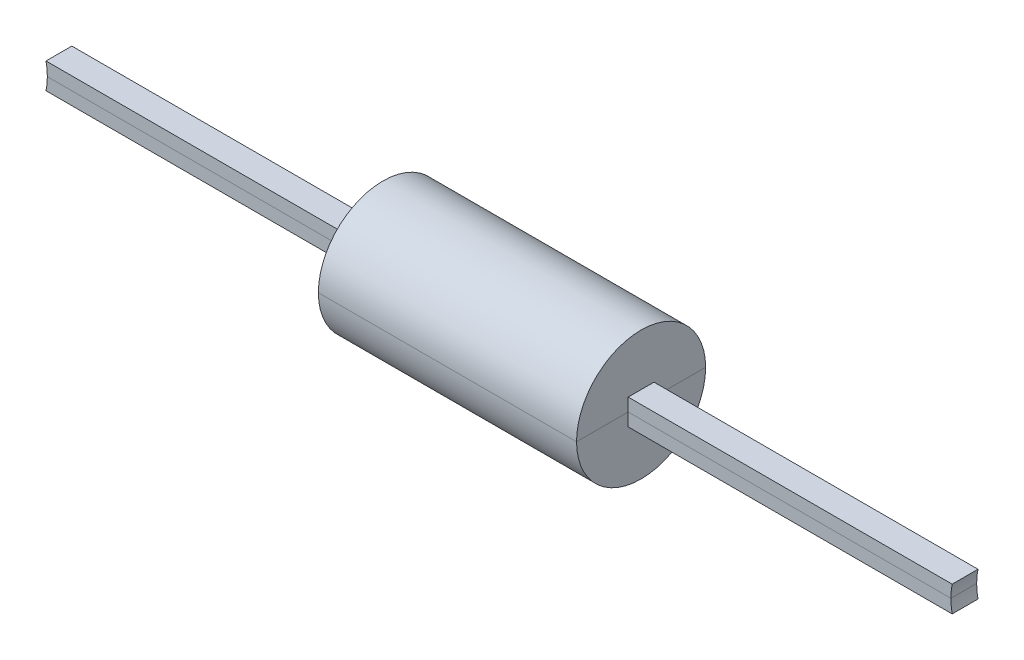
ISO-10303-21;
HEADER;
FILE_DESCRIPTION(('STEP AP214'),'2;1');
FILE_NAME('part.step','',(''),(''),'','','');
FILE_SCHEMA(('AUTOMOTIVE_DESIGN { 1 0 10303 214 1 1 1 1 }'));
ENDSEC;
DATA;
#1=APPLICATION_CONTEXT('core data for automotive mechanical design processes');
#2=APPLICATION_PROTOCOL_DEFINITION('international standard','automotive_design',2000,#1);
#3=PRODUCT_CONTEXT('',#1,'mechanical');
#4=PRODUCT('Part','Part','',(#3));
#5=PRODUCT_RELATED_PRODUCT_CATEGORY('part','',(#4));
#6=PRODUCT_DEFINITION_FORMATION('','',#4);
#7=PRODUCT_DEFINITION_CONTEXT('part definition',#1,'design');
#8=PRODUCT_DEFINITION('design','',#6,#7);
#9=PRODUCT_DEFINITION_SHAPE('','',#8);
#10=(LENGTH_UNIT() NAMED_UNIT(*) SI_UNIT(.MILLI.,.METRE.));
#11=(NAMED_UNIT(*) PLANE_ANGLE_UNIT() SI_UNIT($,.RADIAN.));
#12=(NAMED_UNIT(*) SI_UNIT($,.STERADIAN.) SOLID_ANGLE_UNIT());
#13=UNCERTAINTY_MEASURE_WITH_UNIT(LENGTH_MEASURE(1.E-05),#10,'distance_accuracy_value','');
#14=(GEOMETRIC_REPRESENTATION_CONTEXT(3) GLOBAL_UNCERTAINTY_ASSIGNED_CONTEXT((#13)) GLOBAL_UNIT_ASSIGNED_CONTEXT((#10,
#11,#12)) REPRESENTATION_CONTEXT('',''));
#15=CARTESIAN_POINT('',(0.,0.,0.));
#16=DIRECTION('',(0.,0.,1.));
#17=DIRECTION('',(1.,0.,0.));
#18=AXIS2_PLACEMENT_3D('',#15,#16,#17);
#19=CARTESIAN_POINT('',(0.,0.,0.));
#20=DIRECTION('',(0.,1.,0.));
#21=DIRECTION('',(0.,0.,1.));
#22=AXIS2_PLACEMENT_3D('',#19,#20,#21);
#23=PLANE('',#22);
#24=DIRECTION('',(-1.,0.,0.));
#25=VECTOR('',#24,1.);
#26=CARTESIAN_POINT('',(0.,0.,1.));
#27=LINE('',#26,#25);
#28=CARTESIAN_POINT('',(-10.,0.,1.));
#29=VERTEX_POINT('',#28);
#30=CARTESIAN_POINT('',(-35.,0.,1.));
#31=VERTEX_POINT('',#30);
#32=EDGE_CURVE('E192',#29,#31,#27,.T.);
#33=ORIENTED_EDGE('',*,*,#32,.F.);
#34=DIRECTION('',(0.,0.,1.));
#35=VECTOR('',#34,1.);
#36=CARTESIAN_POINT('',(-10.,0.,0.));
#37=LINE('',#36,#35);
#38=CARTESIAN_POINT('',(-10.,0.,5.));
#39=VERTEX_POINT('',#38);
#40=EDGE_CURVE('E159',#29,#39,#37,.T.);
#41=ORIENTED_EDGE('',*,*,#40,.T.);
#42=DIRECTION('',(-1.,0.,0.));
#43=VECTOR('',#42,1.);
#44=CARTESIAN_POINT('',(10.,0.,5.));
#45=LINE('',#44,#43);
#46=CARTESIAN_POINT('',(10.,0.,5.));
#47=VERTEX_POINT('',#46);
#48=EDGE_CURVE('E197',#39,#47,#45,.F.);
#49=ORIENTED_EDGE('',*,*,#48,.T.);
#50=DIRECTION('',(0.,0.,1.));
#51=VECTOR('',#50,1.);
#52=CARTESIAN_POINT('',(10.,0.,0.));
#53=LINE('',#52,#51);
#54=CARTESIAN_POINT('',(10.,0.,1.));
#55=VERTEX_POINT('',#54);
#56=EDGE_CURVE('E151',#55,#47,#53,.T.);
#57=ORIENTED_EDGE('',*,*,#56,.F.);
#58=DIRECTION('',(-1.,0.,0.));
#59=VECTOR('',#58,1.);
#60=CARTESIAN_POINT('',(0.,0.,1.));
#61=LINE('',#60,#59);
#62=CARTESIAN_POINT('',(35.,0.,1.));
#63=VERTEX_POINT('',#62);
#64=EDGE_CURVE('E166',#63,#55,#61,.T.);
#65=ORIENTED_EDGE('',*,*,#64,.F.);
#66=DIRECTION('',(0.,0.,-1.));
#67=VECTOR('',#66,1.);
#68=CARTESIAN_POINT('',(35.,0.,1.));
#69=LINE('',#68,#67);
#70=CARTESIAN_POINT('',(35.,0.,-1.));
#71=VERTEX_POINT('',#70);
#72=EDGE_CURVE('E155',#71,#63,#69,.F.);
#73=ORIENTED_EDGE('',*,*,#72,.F.);
#74=DIRECTION('',(-1.,0.,0.));
#75=VECTOR('',#74,1.);
#76=CARTESIAN_POINT('',(0.,0.,-1.));
#77=LINE('',#76,#75);
#78=CARTESIAN_POINT('',(10.,0.,-1.));
#79=VERTEX_POINT('',#78);
#80=EDGE_CURVE('E135',#71,#79,#77,.T.);
#81=ORIENTED_EDGE('',*,*,#80,.T.);
#82=CARTESIAN_POINT('',(10.,0.,-5.));
#83=VERTEX_POINT('',#82);
#84=EDGE_CURVE('E144',#83,#79,#53,.T.);
#85=ORIENTED_EDGE('',*,*,#84,.F.);
#86=DIRECTION('',(-1.,0.,0.));
#87=VECTOR('',#86,1.);
#88=CARTESIAN_POINT('',(10.,0.,-5.));
#89=LINE('',#88,#87);
#90=CARTESIAN_POINT('',(-10.,0.,-5.));
#91=VERTEX_POINT('',#90);
#92=EDGE_CURVE('E152',#83,#91,#89,.T.);
#93=ORIENTED_EDGE('',*,*,#92,.T.);
#94=CARTESIAN_POINT('',(-10.,0.,-1.));
#95=VERTEX_POINT('',#94);
#96=EDGE_CURVE('E199',#91,#95,#37,.T.);
#97=ORIENTED_EDGE('',*,*,#96,.T.);
#98=DIRECTION('',(-1.,0.,0.));
#99=VECTOR('',#98,1.);
#100=CARTESIAN_POINT('',(0.,0.,-1.));
#101=LINE('',#100,#99);
#102=CARTESIAN_POINT('',(-35.,0.,-1.));
#103=VERTEX_POINT('',#102);
#104=EDGE_CURVE('E156',#95,#103,#101,.T.);
#105=ORIENTED_EDGE('',*,*,#104,.T.);
#106=DIRECTION('',(0.,0.,-1.));
#107=VECTOR('',#106,1.);
#108=CARTESIAN_POINT('',(-35.,0.,1.));
#109=LINE('',#108,#107);
#110=EDGE_CURVE('E194',#31,#103,#109,.T.);
#111=ORIENTED_EDGE('',*,*,#110,.F.);
#112=EDGE_LOOP('',(#33,#41,#49,#57,#65,#73,#81,#85,#93,#97,#105,#111));
#113=FACE_BOUND('',#112,.T.);
#114=ADVANCED_FACE('F48',(#113),#23,.T.);
#115=CARTESIAN_POINT('',(10.,0.,0.));
#116=DIRECTION('',(-1.,0.,0.));
#117=DIRECTION('',(0.,0.,1.));
#118=AXIS2_PLACEMENT_3D('',#115,#116,#117);
#119=CYLINDRICAL_SURFACE('',#118,5.);
#120=ORIENTED_EDGE('',*,*,#92,.F.);
#121=CARTESIAN_POINT('',(10.,0.,0.));
#122=DIRECTION('',(1.,0.,0.));
#123=DIRECTION('',(0.,0.,-1.));
#124=AXIS2_PLACEMENT_3D('',#121,#122,#123);
#125=CIRCLE('',#124,5.);
#126=EDGE_CURVE('E147',#47,#83,#125,.T.);
#127=ORIENTED_EDGE('',*,*,#126,.F.);
#128=ORIENTED_EDGE('',*,*,#48,.F.);
#129=CARTESIAN_POINT('',(-10.,0.,0.));
#130=DIRECTION('',(1.,0.,0.));
#131=DIRECTION('',(0.,0.,-1.));
#132=AXIS2_PLACEMENT_3D('',#129,#130,#131);
#133=CIRCLE('',#132,5.);
#134=EDGE_CURVE('E169',#39,#91,#133,.T.);
#135=ORIENTED_EDGE('',*,*,#134,.T.);
#136=EDGE_LOOP('',(#120,#127,#128,#135));
#137=FACE_BOUND('',#136,.T.);
#138=ADVANCED_FACE('F221',(#137),#119,.T.);
#139=CARTESIAN_POINT('',(10.,0.,0.));
#140=DIRECTION('',(1.,0.,0.));
#141=DIRECTION('',(0.,0.,-1.));
#142=AXIS2_PLACEMENT_3D('',#139,#140,#141);
#143=PLANE('',#142);
#144=ORIENTED_EDGE('',*,*,#126,.T.);
#145=ORIENTED_EDGE('',*,*,#84,.T.);
#146=DIRECTION('',(0.,-1.,0.));
#147=VECTOR('',#146,1.);
#148=CARTESIAN_POINT('',(10.,0.,-1.));
#149=LINE('',#148,#147);
#150=CARTESIAN_POINT('',(10.,-1.,-1.));
#151=VERTEX_POINT('',#150);
#152=EDGE_CURVE('E131',#79,#151,#149,.T.);
#153=ORIENTED_EDGE('',*,*,#152,.T.);
#154=DIRECTION('',(0.,0.,1.));
#155=VECTOR('',#154,1.);
#156=CARTESIAN_POINT('',(10.,-1.,0.));
#157=LINE('',#156,#155);
#158=CARTESIAN_POINT('',(10.,-1.,1.));
#159=VERTEX_POINT('',#158);
#160=EDGE_CURVE('E171',#151,#159,#157,.T.);
#161=ORIENTED_EDGE('',*,*,#160,.T.);
#162=DIRECTION('',(0.,-1.,0.));
#163=VECTOR('',#162,1.);
#164=CARTESIAN_POINT('',(10.,0.,1.));
#165=LINE('',#164,#163);
#166=EDGE_CURVE('E141',#55,#159,#165,.T.);
#167=ORIENTED_EDGE('',*,*,#166,.F.);
#168=ORIENTED_EDGE('',*,*,#56,.T.);
#169=EDGE_LOOP('',(#144,#145,#153,#161,#167,#168));
#170=FACE_BOUND('',#169,.T.);
#171=ADVANCED_FACE('F145',(#170),#143,.T.);
#172=CARTESIAN_POINT('',(-10.,0.,0.));
#173=DIRECTION('',(1.,0.,0.));
#174=DIRECTION('',(0.,0.,-1.));
#175=AXIS2_PLACEMENT_3D('',#172,#173,#174);
#176=PLANE('',#175);
#177=ORIENTED_EDGE('',*,*,#96,.F.);
#178=ORIENTED_EDGE('',*,*,#134,.F.);
#179=ORIENTED_EDGE('',*,*,#40,.F.);
#180=DIRECTION('',(0.,-1.,0.));
#181=VECTOR('',#180,1.);
#182=CARTESIAN_POINT('',(-10.,0.,1.));
#183=LINE('',#182,#181);
#184=CARTESIAN_POINT('',(-10.,-1.,1.));
#185=VERTEX_POINT('',#184);
#186=EDGE_CURVE('E163',#29,#185,#183,.T.);
#187=ORIENTED_EDGE('',*,*,#186,.T.);
#188=DIRECTION('',(0.,0.,1.));
#189=VECTOR('',#188,1.);
#190=CARTESIAN_POINT('',(-10.,-1.,0.));
#191=LINE('',#190,#189);
#192=CARTESIAN_POINT('',(-10.,-1.,-1.));
#193=VERTEX_POINT('',#192);
#194=EDGE_CURVE('E165',#193,#185,#191,.T.);
#195=ORIENTED_EDGE('',*,*,#194,.F.);
#196=DIRECTION('',(0.,-1.,0.));
#197=VECTOR('',#196,1.);
#198=CARTESIAN_POINT('',(-10.,0.,-1.));
#199=LINE('',#198,#197);
#200=EDGE_CURVE('E83',#95,#193,#199,.T.);
#201=ORIENTED_EDGE('',*,*,#200,.F.);
#202=EDGE_LOOP('',(#177,#178,#179,#187,#195,#201));
#203=FACE_BOUND('',#202,.T.);
#204=ADVANCED_FACE('F229',(#203),#176,.F.);
#205=CARTESIAN_POINT('',(-40.,0.,1.));
#206=DIRECTION('',(0.,0.,-1.));
#207=DIRECTION('',(-1.,0.,0.));
#208=AXIS2_PLACEMENT_3D('',#205,#206,#207);
#209=CYLINDRICAL_SURFACE('',#208,5.);
#210=CARTESIAN_POINT('',(-40.,0.,1.));
#211=DIRECTION('',(0.,0.,1.));
#212=DIRECTION('',(1.,0.,0.));
#213=AXIS2_PLACEMENT_3D('',#210,#211,#212);
#214=CIRCLE('',#213,5.);
#215=CARTESIAN_POINT('',(-35.1010205144336,-1.,1.));
#216=VERTEX_POINT('',#215);
#217=EDGE_CURVE('E173',#216,#31,#214,.T.);
#218=ORIENTED_EDGE('',*,*,#217,.T.);
#219=ORIENTED_EDGE('',*,*,#110,.T.);
#220=CARTESIAN_POINT('',(-40.,0.,-1.));
#221=DIRECTION('',(0.,0.,1.));
#222=DIRECTION('',(1.,0.,0.));
#223=AXIS2_PLACEMENT_3D('',#220,#221,#222);
#224=CIRCLE('',#223,5.);
#225=CARTESIAN_POINT('',(-35.1010205144336,-1.,-1.));
#226=VERTEX_POINT('',#225);
#227=EDGE_CURVE('E57',#226,#103,#224,.T.);
#228=ORIENTED_EDGE('',*,*,#227,.F.);
#229=DIRECTION('',(0.,0.,-1.));
#230=VECTOR('',#229,1.);
#231=CARTESIAN_POINT('',(-35.1010205144336,-1.,1.));
#232=LINE('',#231,#230);
#233=EDGE_CURVE('E65',#216,#226,#232,.T.);
#234=ORIENTED_EDGE('',*,*,#233,.F.);
#235=EDGE_LOOP('',(#218,#219,#228,#234));
#236=FACE_BOUND('',#235,.T.);
#237=ADVANCED_FACE('F215',(#236),#209,.F.);
#238=CARTESIAN_POINT('',(0.,0.,1.));
#239=DIRECTION('',(0.,0.,1.));
#240=DIRECTION('',(1.,0.,0.));
#241=AXIS2_PLACEMENT_3D('',#238,#239,#240);
#242=PLANE('',#241);
#243=ORIENTED_EDGE('',*,*,#186,.F.);
#244=ORIENTED_EDGE('',*,*,#32,.T.);
#245=ORIENTED_EDGE('',*,*,#217,.F.);
#246=DIRECTION('',(1.,0.,0.));
#247=VECTOR('',#246,1.);
#248=CARTESIAN_POINT('',(0.,-1.,1.));
#249=LINE('',#248,#247);
#250=EDGE_CURVE('E187',#216,#185,#249,.T.);
#251=ORIENTED_EDGE('',*,*,#250,.T.);
#252=EDGE_LOOP('',(#243,#244,#245,#251));
#253=FACE_BOUND('',#252,.T.);
#254=ADVANCED_FACE('F208',(#253),#242,.T.);
#255=CARTESIAN_POINT('',(0.,0.,-1.));
#256=DIRECTION('',(0.,0.,1.));
#257=DIRECTION('',(1.,0.,0.));
#258=AXIS2_PLACEMENT_3D('',#255,#256,#257);
#259=PLANE('',#258);
#260=ORIENTED_EDGE('',*,*,#104,.F.);
#261=ORIENTED_EDGE('',*,*,#200,.T.);
#262=DIRECTION('',(1.,0.,0.));
#263=VECTOR('',#262,1.);
#264=CARTESIAN_POINT('',(0.,-1.,-1.));
#265=LINE('',#264,#263);
#266=EDGE_CURVE('E177',#226,#193,#265,.T.);
#267=ORIENTED_EDGE('',*,*,#266,.F.);
#268=ORIENTED_EDGE('',*,*,#227,.T.);
#269=EDGE_LOOP('',(#260,#261,#267,#268));
#270=FACE_BOUND('',#269,.T.);
#271=ADVANCED_FACE('F206',(#270),#259,.F.);
#272=CARTESIAN_POINT('',(40.,0.,1.));
#273=DIRECTION('',(0.,0.,-1.));
#274=DIRECTION('',(-1.,0.,0.));
#275=AXIS2_PLACEMENT_3D('',#272,#273,#274);
#276=CYLINDRICAL_SURFACE('',#275,5.);
#277=CARTESIAN_POINT('',(40.,0.,-1.));
#278=DIRECTION('',(0.,0.,1.));
#279=DIRECTION('',(1.,0.,0.));
#280=AXIS2_PLACEMENT_3D('',#277,#278,#279);
#281=CIRCLE('',#280,5.);
#282=CARTESIAN_POINT('',(35.1010205144336,-1.,-1.));
#283=VERTEX_POINT('',#282);
#284=EDGE_CURVE('E12',#71,#283,#281,.T.);
#285=ORIENTED_EDGE('',*,*,#284,.F.);
#286=ORIENTED_EDGE('',*,*,#72,.T.);
#287=CARTESIAN_POINT('',(40.,0.,1.));
#288=DIRECTION('',(0.,0.,1.));
#289=DIRECTION('',(1.,0.,0.));
#290=AXIS2_PLACEMENT_3D('',#287,#288,#289);
#291=CIRCLE('',#290,5.);
#292=CARTESIAN_POINT('',(35.1010205144336,-1.,1.));
#293=VERTEX_POINT('',#292);
#294=EDGE_CURVE('E76',#63,#293,#291,.T.);
#295=ORIENTED_EDGE('',*,*,#294,.T.);
#296=DIRECTION('',(0.,0.,-1.));
#297=VECTOR('',#296,1.);
#298=CARTESIAN_POINT('',(35.1010205144336,-1.,1.));
#299=LINE('',#298,#297);
#300=EDGE_CURVE('E185',#293,#283,#299,.T.);
#301=ORIENTED_EDGE('',*,*,#300,.T.);
#302=EDGE_LOOP('',(#285,#286,#295,#301));
#303=FACE_BOUND('',#302,.T.);
#304=ADVANCED_FACE('F50',(#303),#276,.F.);
#305=ORIENTED_EDGE('',*,*,#294,.F.);
#306=ORIENTED_EDGE('',*,*,#64,.T.);
#307=ORIENTED_EDGE('',*,*,#166,.T.);
#308=EDGE_CURVE('E176',#159,#293,#249,.T.);
#309=ORIENTED_EDGE('',*,*,#308,.T.);
#310=EDGE_LOOP('',(#305,#306,#307,#309));
#311=FACE_BOUND('',#310,.T.);
#312=ADVANCED_FACE('F214',(#311),#242,.T.);
#313=ORIENTED_EDGE('',*,*,#80,.F.);
#314=ORIENTED_EDGE('',*,*,#284,.T.);
#315=EDGE_CURVE('E137',#151,#283,#265,.T.);
#316=ORIENTED_EDGE('',*,*,#315,.F.);
#317=ORIENTED_EDGE('',*,*,#152,.F.);
#318=EDGE_LOOP('',(#313,#314,#316,#317));
#319=FACE_BOUND('',#318,.T.);
#320=ADVANCED_FACE('F133',(#319),#259,.F.);
#321=CARTESIAN_POINT('',(0.,-1.,1.));
#322=DIRECTION('',(0.,1.,0.));
#323=DIRECTION('',(0.,0.,1.));
#324=AXIS2_PLACEMENT_3D('',#321,#322,#323);
#325=PLANE('',#324);
#326=ORIENTED_EDGE('',*,*,#266,.T.);
#327=ORIENTED_EDGE('',*,*,#194,.T.);
#328=ORIENTED_EDGE('',*,*,#250,.F.);
#329=ORIENTED_EDGE('',*,*,#233,.T.);
#330=EDGE_LOOP('',(#326,#327,#328,#329));
#331=FACE_BOUND('',#330,.T.);
#332=ADVANCED_FACE('F220',(#331),#325,.F.);
#333=ORIENTED_EDGE('',*,*,#160,.F.);
#334=ORIENTED_EDGE('',*,*,#315,.T.);
#335=ORIENTED_EDGE('',*,*,#300,.F.);
#336=ORIENTED_EDGE('',*,*,#308,.F.);
#337=EDGE_LOOP('',(#333,#334,#335,#336));
#338=FACE_BOUND('',#337,.T.);
#339=ADVANCED_FACE('F231',(#338),#325,.F.);
#340=CLOSED_SHELL('',(#114,#138,#171,#204,#237,#254,#271,#304,#312,#320,#332,#339));
#341=MANIFOLD_SOLID_BREP('B2',#340);
#342=CARTESIAN_POINT('',(0.,0.,0.));
#343=DIRECTION('',(0.,1.,0.));
#344=DIRECTION('',(0.,0.,1.));
#345=AXIS2_PLACEMENT_3D('',#342,#343,#344);
#346=PLANE('',#345);
#347=DIRECTION('',(-1.,0.,0.));
#348=VECTOR('',#347,1.);
#349=CARTESIAN_POINT('',(0.,0.,1.));
#350=LINE('',#349,#348);
#351=CARTESIAN_POINT('',(-10.,0.,1.));
#352=VERTEX_POINT('',#351);
#353=CARTESIAN_POINT('',(-35.,0.,1.));
#354=VERTEX_POINT('',#353);
#355=EDGE_CURVE('E325',#352,#354,#350,.T.);
#356=ORIENTED_EDGE('',*,*,#355,.T.);
#357=DIRECTION('',(0.,0.,-1.));
#358=VECTOR('',#357,1.);
#359=CARTESIAN_POINT('',(-35.,0.,1.));
#360=LINE('',#359,#358);
#361=CARTESIAN_POINT('',(-35.,0.,-1.));
#362=VERTEX_POINT('',#361);
#363=EDGE_CURVE('E458',#354,#362,#360,.T.);
#364=ORIENTED_EDGE('',*,*,#363,.T.);
#365=DIRECTION('',(-1.,0.,0.));
#366=VECTOR('',#365,1.);
#367=CARTESIAN_POINT('',(0.,0.,-1.));
#368=LINE('',#367,#366);
#369=CARTESIAN_POINT('',(-10.,0.,-1.));
#370=VERTEX_POINT('',#369);
#371=EDGE_CURVE('E455',#370,#362,#368,.T.);
#372=ORIENTED_EDGE('',*,*,#371,.F.);
#373=DIRECTION('',(0.,0.,1.));
#374=VECTOR('',#373,1.);
#375=CARTESIAN_POINT('',(-10.,0.,0.));
#376=LINE('',#375,#374);
#377=CARTESIAN_POINT('',(-10.,0.,-5.));
#378=VERTEX_POINT('',#377);
#379=EDGE_CURVE('E463',#378,#370,#376,.T.);
#380=ORIENTED_EDGE('',*,*,#379,.F.);
#381=DIRECTION('',(-1.,0.,0.));
#382=VECTOR('',#381,1.);
#383=CARTESIAN_POINT('',(10.,0.,-5.));
#384=LINE('',#383,#382);
#385=CARTESIAN_POINT('',(10.,0.,-5.));
#386=VERTEX_POINT('',#385);
#387=EDGE_CURVE('E460',#386,#378,#384,.T.);
#388=ORIENTED_EDGE('',*,*,#387,.F.);
#389=DIRECTION('',(0.,0.,1.));
#390=VECTOR('',#389,1.);
#391=CARTESIAN_POINT('',(10.,0.,0.));
#392=LINE('',#391,#390);
#393=CARTESIAN_POINT('',(10.,0.,-1.));
#394=VERTEX_POINT('',#393);
#395=EDGE_CURVE('E459',#386,#394,#392,.T.);
#396=ORIENTED_EDGE('',*,*,#395,.T.);
#397=DIRECTION('',(-1.,0.,0.));
#398=VECTOR('',#397,1.);
#399=CARTESIAN_POINT('',(0.,0.,-1.));
#400=LINE('',#399,#398);
#401=CARTESIAN_POINT('',(35.,0.,-1.));
#402=VERTEX_POINT('',#401);
#403=EDGE_CURVE('E453',#402,#394,#400,.T.);
#404=ORIENTED_EDGE('',*,*,#403,.F.);
#405=DIRECTION('',(0.,0.,-1.));
#406=VECTOR('',#405,1.);
#407=CARTESIAN_POINT('',(35.,0.,1.));
#408=LINE('',#407,#406);
#409=CARTESIAN_POINT('',(35.,0.,1.));
#410=VERTEX_POINT('',#409);
#411=EDGE_CURVE('E330',#402,#410,#408,.F.);
#412=ORIENTED_EDGE('',*,*,#411,.T.);
#413=DIRECTION('',(-1.,0.,0.));
#414=VECTOR('',#413,1.);
#415=CARTESIAN_POINT('',(0.,0.,1.));
#416=LINE('',#415,#414);
#417=CARTESIAN_POINT('',(10.,0.,1.));
#418=VERTEX_POINT('',#417);
#419=EDGE_CURVE('E46',#410,#418,#416,.T.);
#420=ORIENTED_EDGE('',*,*,#419,.T.);
#421=CARTESIAN_POINT('',(10.,0.,5.));
#422=VERTEX_POINT('',#421);
#423=EDGE_CURVE('E338',#418,#422,#392,.T.);
#424=ORIENTED_EDGE('',*,*,#423,.T.);
#425=DIRECTION('',(-1.,0.,0.));
#426=VECTOR('',#425,1.);
#427=CARTESIAN_POINT('',(10.,0.,5.));
#428=LINE('',#427,#426);
#429=CARTESIAN_POINT('',(-10.,0.,5.));
#430=VERTEX_POINT('',#429);
#431=EDGE_CURVE('E461',#430,#422,#428,.F.);
#432=ORIENTED_EDGE('',*,*,#431,.F.);
#433=EDGE_CURVE('E465',#352,#430,#376,.T.);
#434=ORIENTED_EDGE('',*,*,#433,.F.);
#435=EDGE_LOOP('',(#356,#364,#372,#380,#388,#396,#404,#412,#420,#424,#432,#434));
#436=FACE_BOUND('',#435,.T.);
#437=ADVANCED_FACE('F322',(#436),#346,.F.);
#438=CARTESIAN_POINT('',(10.,0.,0.));
#439=DIRECTION('',(-1.,0.,0.));
#440=DIRECTION('',(0.,0.,1.));
#441=AXIS2_PLACEMENT_3D('',#438,#439,#440);
#442=CYLINDRICAL_SURFACE('',#441,5.);
#443=CARTESIAN_POINT('',(10.,0.,0.));
#444=DIRECTION('',(1.,0.,0.));
#445=DIRECTION('',(0.,0.,-1.));
#446=AXIS2_PLACEMENT_3D('',#443,#444,#445);
#447=CIRCLE('',#446,5.);
#448=EDGE_CURVE('E441',#386,#422,#447,.T.);
#449=ORIENTED_EDGE('',*,*,#448,.F.);
#450=ORIENTED_EDGE('',*,*,#387,.T.);
#451=CARTESIAN_POINT('',(-10.,0.,0.));
#452=DIRECTION('',(1.,0.,0.));
#453=DIRECTION('',(0.,0.,-1.));
#454=AXIS2_PLACEMENT_3D('',#451,#452,#453);
#455=CIRCLE('',#454,5.);
#456=EDGE_CURVE('E440',#378,#430,#455,.T.);
#457=ORIENTED_EDGE('',*,*,#456,.T.);
#458=ORIENTED_EDGE('',*,*,#431,.T.);
#459=EDGE_LOOP('',(#449,#450,#457,#458));
#460=FACE_BOUND('',#459,.T.);
#461=ADVANCED_FACE('F496',(#460),#442,.T.);
#462=CARTESIAN_POINT('',(0.,1.,1.));
#463=DIRECTION('',(0.,1.,0.));
#464=DIRECTION('',(0.,0.,1.));
#465=AXIS2_PLACEMENT_3D('',#462,#463,#464);
#466=PLANE('',#465);
#467=DIRECTION('',(0.,0.,1.));
#468=VECTOR('',#467,1.);
#469=CARTESIAN_POINT('',(-10.,1.,0.));
#470=LINE('',#469,#468);
#471=CARTESIAN_POINT('',(-10.,1.,-1.));
#472=VERTEX_POINT('',#471);
#473=CARTESIAN_POINT('',(-10.,1.,1.));
#474=VERTEX_POINT('',#473);
#475=EDGE_CURVE('E448',#472,#474,#470,.T.);
#476=ORIENTED_EDGE('',*,*,#475,.F.);
#477=DIRECTION('',(1.,0.,0.));
#478=VECTOR('',#477,1.);
#479=CARTESIAN_POINT('',(0.,1.,-1.));
#480=LINE('',#479,#478);
#481=CARTESIAN_POINT('',(-35.1010205144336,1.,-1.));
#482=VERTEX_POINT('',#481);
#483=EDGE_CURVE('E423',#482,#472,#480,.T.);
#484=ORIENTED_EDGE('',*,*,#483,.F.);
#485=DIRECTION('',(0.,0.,-1.));
#486=VECTOR('',#485,1.);
#487=CARTESIAN_POINT('',(-35.1010205144336,1.,1.));
#488=LINE('',#487,#486);
#489=CARTESIAN_POINT('',(-35.1010205144336,1.,1.));
#490=VERTEX_POINT('',#489);
#491=EDGE_CURVE('E418',#490,#482,#488,.T.);
#492=ORIENTED_EDGE('',*,*,#491,.F.);
#493=DIRECTION('',(1.,0.,0.));
#494=VECTOR('',#493,1.);
#495=CARTESIAN_POINT('',(0.,1.,1.));
#496=LINE('',#495,#494);
#497=EDGE_CURVE('E409',#490,#474,#496,.T.);
#498=ORIENTED_EDGE('',*,*,#497,.T.);
#499=EDGE_LOOP('',(#476,#484,#492,#498));
#500=FACE_BOUND('',#499,.T.);
#501=ADVANCED_FACE('F485',(#500),#466,.T.);
#502=CARTESIAN_POINT('',(-40.,0.,1.));
#503=DIRECTION('',(0.,0.,-1.));
#504=DIRECTION('',(-1.,0.,0.));
#505=AXIS2_PLACEMENT_3D('',#502,#503,#504);
#506=CYLINDRICAL_SURFACE('',#505,5.);
#507=ORIENTED_EDGE('',*,*,#363,.F.);
#508=CARTESIAN_POINT('',(-40.,0.,1.));
#509=DIRECTION('',(0.,0.,1.));
#510=DIRECTION('',(1.,0.,0.));
#511=AXIS2_PLACEMENT_3D('',#508,#509,#510);
#512=CIRCLE('',#511,5.);
#513=EDGE_CURVE('E427',#354,#490,#512,.T.);
#514=ORIENTED_EDGE('',*,*,#513,.T.);
#515=ORIENTED_EDGE('',*,*,#491,.T.);
#516=CARTESIAN_POINT('',(-40.,0.,-1.));
#517=DIRECTION('',(0.,0.,1.));
#518=DIRECTION('',(1.,0.,0.));
#519=AXIS2_PLACEMENT_3D('',#516,#517,#518);
#520=CIRCLE('',#519,5.);
#521=EDGE_CURVE('E421',#362,#482,#520,.T.);
#522=ORIENTED_EDGE('',*,*,#521,.F.);
#523=EDGE_LOOP('',(#507,#514,#515,#522));
#524=FACE_BOUND('',#523,.T.);
#525=ADVANCED_FACE('F481',(#524),#506,.F.);
#526=CARTESIAN_POINT('',(-10.,0.,0.));
#527=DIRECTION('',(1.,0.,0.));
#528=DIRECTION('',(0.,0.,-1.));
#529=AXIS2_PLACEMENT_3D('',#526,#527,#528);
#530=PLANE('',#529);
#531=ORIENTED_EDGE('',*,*,#456,.F.);
#532=ORIENTED_EDGE('',*,*,#379,.T.);
#533=DIRECTION('',(0.,-1.,0.));
#534=VECTOR('',#533,1.);
#535=CARTESIAN_POINT('',(-10.,0.,-1.));
#536=LINE('',#535,#534);
#537=EDGE_CURVE('E443',#472,#370,#536,.T.);
#538=ORIENTED_EDGE('',*,*,#537,.F.);
#539=ORIENTED_EDGE('',*,*,#475,.T.);
#540=DIRECTION('',(0.,-1.,0.));
#541=VECTOR('',#540,1.);
#542=CARTESIAN_POINT('',(-10.,0.,1.));
#543=LINE('',#542,#541);
#544=EDGE_CURVE('E450',#474,#352,#543,.T.);
#545=ORIENTED_EDGE('',*,*,#544,.T.);
#546=ORIENTED_EDGE('',*,*,#433,.T.);
#547=EDGE_LOOP('',(#531,#532,#538,#539,#545,#546));
#548=FACE_BOUND('',#547,.T.);
#549=ADVANCED_FACE('F494',(#548),#530,.F.);
#550=CARTESIAN_POINT('',(0.,0.,-1.));
#551=DIRECTION('',(0.,0.,1.));
#552=DIRECTION('',(1.,0.,0.));
#553=AXIS2_PLACEMENT_3D('',#550,#551,#552);
#554=PLANE('',#553);
#555=ORIENTED_EDGE('',*,*,#537,.T.);
#556=ORIENTED_EDGE('',*,*,#371,.T.);
#557=ORIENTED_EDGE('',*,*,#521,.T.);
#558=ORIENTED_EDGE('',*,*,#483,.T.);
#559=EDGE_LOOP('',(#555,#556,#557,#558));
#560=FACE_BOUND('',#559,.T.);
#561=ADVANCED_FACE('F487',(#560),#554,.F.);
#562=CARTESIAN_POINT('',(0.,0.,1.));
#563=DIRECTION('',(0.,0.,1.));
#564=DIRECTION('',(1.,0.,0.));
#565=AXIS2_PLACEMENT_3D('',#562,#563,#564);
#566=PLANE('',#565);
#567=ORIENTED_EDGE('',*,*,#355,.F.);
#568=ORIENTED_EDGE('',*,*,#544,.F.);
#569=ORIENTED_EDGE('',*,*,#497,.F.);
#570=ORIENTED_EDGE('',*,*,#513,.F.);
#571=EDGE_LOOP('',(#567,#568,#569,#570));
#572=FACE_BOUND('',#571,.T.);
#573=ADVANCED_FACE('F478',(#572),#566,.T.);
#574=CARTESIAN_POINT('',(10.,1.,-1.));
#575=VERTEX_POINT('',#574);
#576=CARTESIAN_POINT('',(35.1010205144336,1.,-1.));
#577=VERTEX_POINT('',#576);
#578=EDGE_CURVE('E430',#575,#577,#480,.T.);
#579=ORIENTED_EDGE('',*,*,#578,.F.);
#580=DIRECTION('',(0.,0.,1.));
#581=VECTOR('',#580,1.);
#582=CARTESIAN_POINT('',(10.,1.,0.));
#583=LINE('',#582,#581);
#584=CARTESIAN_POINT('',(10.,1.,1.));
#585=VERTEX_POINT('',#584);
#586=EDGE_CURVE('E408',#575,#585,#583,.T.);
#587=ORIENTED_EDGE('',*,*,#586,.T.);
#588=CARTESIAN_POINT('',(35.1010205144336,1.,1.));
#589=VERTEX_POINT('',#588);
#590=EDGE_CURVE('E401',#585,#589,#496,.T.);
#591=ORIENTED_EDGE('',*,*,#590,.T.);
#592=DIRECTION('',(0.,0.,-1.));
#593=VECTOR('',#592,1.);
#594=CARTESIAN_POINT('',(35.1010205144336,1.,1.));
#595=LINE('',#594,#593);
#596=EDGE_CURVE('E405',#589,#577,#595,.T.);
#597=ORIENTED_EDGE('',*,*,#596,.T.);
#598=EDGE_LOOP('',(#579,#587,#591,#597));
#599=FACE_BOUND('',#598,.T.);
#600=ADVANCED_FACE('F404',(#599),#466,.T.);
#601=CARTESIAN_POINT('',(10.,0.,0.));
#602=DIRECTION('',(1.,0.,0.));
#603=DIRECTION('',(0.,0.,-1.));
#604=AXIS2_PLACEMENT_3D('',#601,#602,#603);
#605=PLANE('',#604);
#606=ORIENTED_EDGE('',*,*,#395,.F.);
#607=ORIENTED_EDGE('',*,*,#448,.T.);
#608=ORIENTED_EDGE('',*,*,#423,.F.);
#609=DIRECTION('',(0.,-1.,0.));
#610=VECTOR('',#609,1.);
#611=CARTESIAN_POINT('',(10.,0.,1.));
#612=LINE('',#611,#610);
#613=EDGE_CURVE('E437',#585,#418,#612,.T.);
#614=ORIENTED_EDGE('',*,*,#613,.F.);
#615=ORIENTED_EDGE('',*,*,#586,.F.);
#616=DIRECTION('',(0.,-1.,0.));
#617=VECTOR('',#616,1.);
#618=CARTESIAN_POINT('',(10.,0.,-1.));
#619=LINE('',#618,#617);
#620=EDGE_CURVE('E417',#575,#394,#619,.T.);
#621=ORIENTED_EDGE('',*,*,#620,.T.);
#622=EDGE_LOOP('',(#606,#607,#608,#614,#615,#621));
#623=FACE_BOUND('',#622,.T.);
#624=ADVANCED_FACE('F497',(#623),#605,.T.);
#625=CARTESIAN_POINT('',(40.,0.,1.));
#626=DIRECTION('',(0.,0.,-1.));
#627=DIRECTION('',(-1.,0.,0.));
#628=AXIS2_PLACEMENT_3D('',#625,#626,#627);
#629=CYLINDRICAL_SURFACE('',#628,5.);
#630=ORIENTED_EDGE('',*,*,#411,.F.);
#631=CARTESIAN_POINT('',(40.,0.,-1.));
#632=DIRECTION('',(0.,0.,1.));
#633=DIRECTION('',(1.,0.,0.));
#634=AXIS2_PLACEMENT_3D('',#631,#632,#633);
#635=CIRCLE('',#634,5.);
#636=EDGE_CURVE('E416',#577,#402,#635,.T.);
#637=ORIENTED_EDGE('',*,*,#636,.F.);
#638=ORIENTED_EDGE('',*,*,#596,.F.);
#639=CARTESIAN_POINT('',(40.,0.,1.));
#640=DIRECTION('',(0.,0.,1.));
#641=DIRECTION('',(1.,0.,0.));
#642=AXIS2_PLACEMENT_3D('',#639,#640,#641);
#643=CIRCLE('',#642,5.);
#644=EDGE_CURVE('E410',#589,#410,#643,.T.);
#645=ORIENTED_EDGE('',*,*,#644,.T.);
#646=EDGE_LOOP('',(#630,#637,#638,#645));
#647=FACE_BOUND('',#646,.T.);
#648=ADVANCED_FACE('F414',(#647),#629,.F.);
#649=ORIENTED_EDGE('',*,*,#636,.T.);
#650=ORIENTED_EDGE('',*,*,#403,.T.);
#651=ORIENTED_EDGE('',*,*,#620,.F.);
#652=ORIENTED_EDGE('',*,*,#578,.T.);
#653=EDGE_LOOP('',(#649,#650,#651,#652));
#654=FACE_BOUND('',#653,.T.);
#655=ADVANCED_FACE('F500',(#654),#554,.F.);
#656=ORIENTED_EDGE('',*,*,#419,.F.);
#657=ORIENTED_EDGE('',*,*,#644,.F.);
#658=ORIENTED_EDGE('',*,*,#590,.F.);
#659=ORIENTED_EDGE('',*,*,#613,.T.);
#660=EDGE_LOOP('',(#656,#657,#658,#659));
#661=FACE_BOUND('',#660,.T.);
#662=ADVANCED_FACE('F420',(#661),#566,.T.);
#663=CLOSED_SHELL('',(#437,#461,#501,#525,#549,#561,#573,#600,#624,#648,#655,#662));
#664=MANIFOLD_SOLID_BREP('B6',#663);
#665=ADVANCED_BREP_SHAPE_REPRESENTATION('',(#18,#341,#664),#14);
#666=SHAPE_DEFINITION_REPRESENTATION(#9,#665);
ENDSEC;
END-ISO-10303-21;
